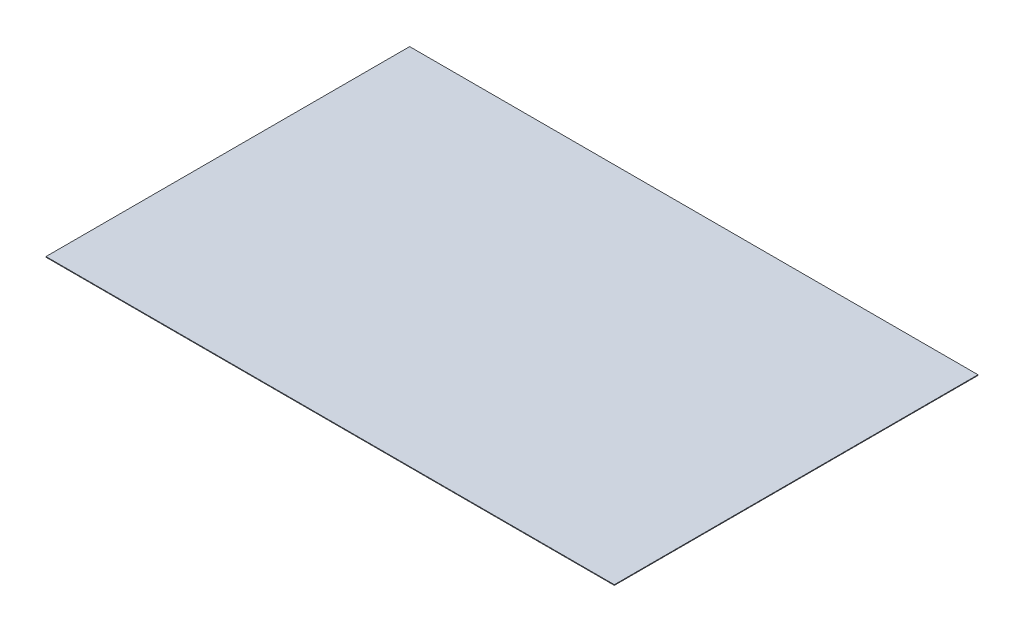
ISO-10303-21;
HEADER;
FILE_DESCRIPTION(('STEP AP214'),'2;1');
FILE_NAME('part.step','',(''),(''),'','','');
FILE_SCHEMA(('AUTOMOTIVE_DESIGN { 1 0 10303 214 1 1 1 1 }'));
ENDSEC;
DATA;
#1=APPLICATION_CONTEXT('core data for automotive mechanical design processes');
#2=APPLICATION_PROTOCOL_DEFINITION('international standard','automotive_design',2000,#1);
#3=PRODUCT_CONTEXT('',#1,'mechanical');
#4=PRODUCT('Part','Part','',(#3));
#5=PRODUCT_RELATED_PRODUCT_CATEGORY('part','',(#4));
#6=PRODUCT_DEFINITION_FORMATION('','',#4);
#7=PRODUCT_DEFINITION_CONTEXT('part definition',#1,'design');
#8=PRODUCT_DEFINITION('design','',#6,#7);
#9=PRODUCT_DEFINITION_SHAPE('','',#8);
#10=(LENGTH_UNIT() NAMED_UNIT(*) SI_UNIT(.MILLI.,.METRE.));
#11=(NAMED_UNIT(*) PLANE_ANGLE_UNIT() SI_UNIT($,.RADIAN.));
#12=(NAMED_UNIT(*) SI_UNIT($,.STERADIAN.) SOLID_ANGLE_UNIT());
#13=UNCERTAINTY_MEASURE_WITH_UNIT(LENGTH_MEASURE(1.E-05),#10,'distance_accuracy_value','');
#14=(GEOMETRIC_REPRESENTATION_CONTEXT(3) GLOBAL_UNCERTAINTY_ASSIGNED_CONTEXT((#13)) GLOBAL_UNIT_ASSIGNED_CONTEXT((#10,
#11,#12)) REPRESENTATION_CONTEXT('',''));
#15=CARTESIAN_POINT('',(0.,0.,0.));
#16=DIRECTION('',(0.,0.,1.));
#17=DIRECTION('',(1.,0.,0.));
#18=AXIS2_PLACEMENT_3D('',#15,#16,#17);
#19=CARTESIAN_POINT('',(0.,9.525,0.));
#20=DIRECTION('',(-1.,0.,0.));
#21=DIRECTION('',(0.,0.,1.));
#22=AXIS2_PLACEMENT_3D('',#19,#20,#21);
#23=PLANE('',#22);
#24=DIRECTION('',(0.,0.,-1.));
#25=VECTOR('',#24,1.);
#26=CARTESIAN_POINT('',(0.,0.,0.));
#27=LINE('',#26,#25);
#28=CARTESIAN_POINT('',(0.,0.,0.));
#29=VERTEX_POINT('',#28);
#30=CARTESIAN_POINT('',(0.,0.,-5400.));
#31=VERTEX_POINT('',#30);
#32=EDGE_CURVE('E98',#29,#31,#27,.T.);
#33=ORIENTED_EDGE('',*,*,#32,.T.);
#34=DIRECTION('',(0.,-1.,0.));
#35=VECTOR('',#34,1.);
#36=CARTESIAN_POINT('',(0.,9.525,-5400.));
#37=LINE('',#36,#35);
#38=CARTESIAN_POINT('',(0.,9.525,-5400.));
#39=VERTEX_POINT('',#38);
#40=EDGE_CURVE('E11',#39,#31,#37,.T.);
#41=ORIENTED_EDGE('',*,*,#40,.F.);
#42=DIRECTION('',(0.,0.,-1.));
#43=VECTOR('',#42,1.);
#44=CARTESIAN_POINT('',(0.,9.525,0.));
#45=LINE('',#44,#43);
#46=CARTESIAN_POINT('',(0.,9.525,0.));
#47=VERTEX_POINT('',#46);
#48=EDGE_CURVE('E86',#47,#39,#45,.T.);
#49=ORIENTED_EDGE('',*,*,#48,.F.);
#50=DIRECTION('',(0.,-1.,0.));
#51=VECTOR('',#50,1.);
#52=CARTESIAN_POINT('',(0.,9.525,0.));
#53=LINE('',#52,#51);
#54=EDGE_CURVE('E94',#47,#29,#53,.T.);
#55=ORIENTED_EDGE('',*,*,#54,.T.);
#56=EDGE_LOOP('',(#33,#41,#49,#55));
#57=FACE_BOUND('',#56,.T.);
#58=ADVANCED_FACE('F35',(#57),#23,.F.);
#59=CARTESIAN_POINT('',(0.,9.525,-5400.));
#60=DIRECTION('',(0.,0.,1.));
#61=DIRECTION('',(1.,0.,0.));
#62=AXIS2_PLACEMENT_3D('',#59,#60,#61);
#63=PLANE('',#62);
#64=DIRECTION('',(-1.,0.,0.));
#65=VECTOR('',#64,1.);
#66=CARTESIAN_POINT('',(0.,0.,-5400.));
#67=LINE('',#66,#65);
#68=CARTESIAN_POINT('',(-8440.,0.,-5400.));
#69=VERTEX_POINT('',#68);
#70=EDGE_CURVE('E90',#31,#69,#67,.T.);
#71=ORIENTED_EDGE('',*,*,#70,.T.);
#72=DIRECTION('',(0.,-1.,0.));
#73=VECTOR('',#72,1.);
#74=CARTESIAN_POINT('',(-8440.,9.525,-5400.));
#75=LINE('',#74,#73);
#76=CARTESIAN_POINT('',(-8440.,9.525,-5400.));
#77=VERTEX_POINT('',#76);
#78=EDGE_CURVE('E43',#77,#69,#75,.T.);
#79=ORIENTED_EDGE('',*,*,#78,.F.);
#80=DIRECTION('',(-1.,0.,0.));
#81=VECTOR('',#80,1.);
#82=CARTESIAN_POINT('',(0.,9.525,-5400.));
#83=LINE('',#82,#81);
#84=EDGE_CURVE('E81',#39,#77,#83,.T.);
#85=ORIENTED_EDGE('',*,*,#84,.F.);
#86=ORIENTED_EDGE('',*,*,#40,.T.);
#87=EDGE_LOOP('',(#71,#79,#85,#86));
#88=FACE_BOUND('',#87,.T.);
#89=ADVANCED_FACE('F89',(#88),#63,.F.);
#90=CARTESIAN_POINT('',(-8440.,9.525,1.03360189848037E-12));
#91=DIRECTION('',(1.,0.,0.));
#92=DIRECTION('',(0.,0.,-1.));
#93=AXIS2_PLACEMENT_3D('',#90,#91,#92);
#94=PLANE('',#93);
#95=DIRECTION('',(0.,0.,1.));
#96=VECTOR('',#95,1.);
#97=CARTESIAN_POINT('',(-8440.,0.,1.03360189848037E-12));
#98=LINE('',#97,#96);
#99=CARTESIAN_POINT('',(-8440.,0.,1.03360189848037E-12));
#100=VERTEX_POINT('',#99);
#101=EDGE_CURVE('E68',#69,#100,#98,.T.);
#102=ORIENTED_EDGE('',*,*,#101,.T.);
#103=DIRECTION('',(0.,-1.,0.));
#104=VECTOR('',#103,1.);
#105=CARTESIAN_POINT('',(-8440.,9.525,1.03360189848037E-12));
#106=LINE('',#105,#104);
#107=CARTESIAN_POINT('',(-8440.,9.525,1.03360189848037E-12));
#108=VERTEX_POINT('',#107);
#109=EDGE_CURVE('E91',#108,#100,#106,.T.);
#110=ORIENTED_EDGE('',*,*,#109,.F.);
#111=DIRECTION('',(0.,0.,1.));
#112=VECTOR('',#111,1.);
#113=CARTESIAN_POINT('',(-8440.,9.525,1.03360189848037E-12));
#114=LINE('',#113,#112);
#115=EDGE_CURVE('E84',#77,#108,#114,.T.);
#116=ORIENTED_EDGE('',*,*,#115,.F.);
#117=ORIENTED_EDGE('',*,*,#78,.T.);
#118=EDGE_LOOP('',(#102,#110,#116,#117));
#119=FACE_BOUND('',#118,.T.);
#120=ADVANCED_FACE('F92',(#119),#94,.F.);
#121=CARTESIAN_POINT('',(0.,9.525,0.));
#122=DIRECTION('',(0.,0.,-1.));
#123=DIRECTION('',(-1.,0.,0.));
#124=AXIS2_PLACEMENT_3D('',#121,#122,#123);
#125=PLANE('',#124);
#126=DIRECTION('',(1.,0.,0.));
#127=VECTOR('',#126,1.);
#128=CARTESIAN_POINT('',(0.,0.,0.));
#129=LINE('',#128,#127);
#130=EDGE_CURVE('E74',#100,#29,#129,.T.);
#131=ORIENTED_EDGE('',*,*,#130,.T.);
#132=ORIENTED_EDGE('',*,*,#54,.F.);
#133=DIRECTION('',(1.,0.,0.));
#134=VECTOR('',#133,1.);
#135=CARTESIAN_POINT('',(0.,9.525,0.));
#136=LINE('',#135,#134);
#137=EDGE_CURVE('E51',#108,#47,#136,.T.);
#138=ORIENTED_EDGE('',*,*,#137,.F.);
#139=ORIENTED_EDGE('',*,*,#109,.T.);
#140=EDGE_LOOP('',(#131,#132,#138,#139));
#141=FACE_BOUND('',#140,.T.);
#142=ADVANCED_FACE('F105',(#141),#125,.F.);
#143=CARTESIAN_POINT('',(0.,9.525,0.));
#144=DIRECTION('',(0.,1.,0.));
#145=DIRECTION('',(0.,0.,1.));
#146=AXIS2_PLACEMENT_3D('',#143,#144,#145);
#147=PLANE('',#146);
#148=ORIENTED_EDGE('',*,*,#48,.T.);
#149=ORIENTED_EDGE('',*,*,#84,.T.);
#150=ORIENTED_EDGE('',*,*,#115,.T.);
#151=ORIENTED_EDGE('',*,*,#137,.T.);
#152=EDGE_LOOP('',(#148,#149,#150,#151));
#153=FACE_BOUND('',#152,.T.);
#154=ADVANCED_FACE('F82',(#153),#147,.T.);
#155=CARTESIAN_POINT('',(0.,0.,0.));
#156=DIRECTION('',(0.,1.,0.));
#157=DIRECTION('',(0.,0.,1.));
#158=AXIS2_PLACEMENT_3D('',#155,#156,#157);
#159=PLANE('',#158);
#160=ORIENTED_EDGE('',*,*,#32,.F.);
#161=ORIENTED_EDGE('',*,*,#130,.F.);
#162=ORIENTED_EDGE('',*,*,#101,.F.);
#163=ORIENTED_EDGE('',*,*,#70,.F.);
#164=EDGE_LOOP('',(#160,#161,#162,#163));
#165=FACE_BOUND('',#164,.T.);
#166=ADVANCED_FACE('F108',(#165),#159,.F.);
#167=CLOSED_SHELL('',(#58,#89,#120,#142,#154,#166));
#168=MANIFOLD_SOLID_BREP('B2',#167);
#169=ADVANCED_BREP_SHAPE_REPRESENTATION('',(#18,#168),#14);
#170=SHAPE_DEFINITION_REPRESENTATION(#9,#169);
ENDSEC;
END-ISO-10303-21;
